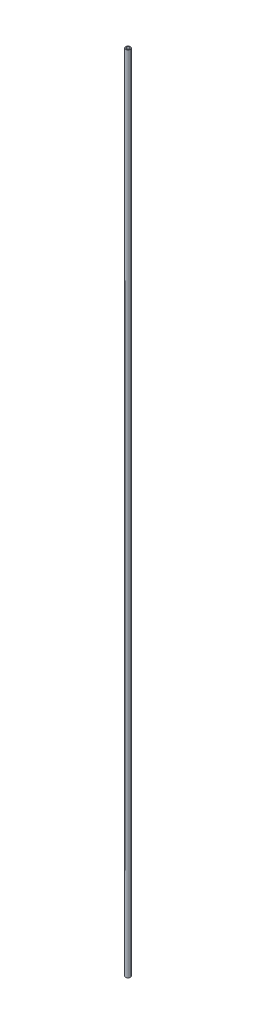
ISO-10303-21;
HEADER;
FILE_DESCRIPTION(('STEP AP214'),'2;1');
FILE_NAME('part.step','',(''),(''),'','','');
FILE_SCHEMA(('AUTOMOTIVE_DESIGN { 1 0 10303 214 1 1 1 1 }'));
ENDSEC;
DATA;
#1=APPLICATION_CONTEXT('core data for automotive mechanical design processes');
#2=APPLICATION_PROTOCOL_DEFINITION('international standard','automotive_design',2000,#1);
#3=PRODUCT_CONTEXT('',#1,'mechanical');
#4=PRODUCT('Part','Part','',(#3));
#5=PRODUCT_RELATED_PRODUCT_CATEGORY('part','',(#4));
#6=PRODUCT_DEFINITION_FORMATION('','',#4);
#7=PRODUCT_DEFINITION_CONTEXT('part definition',#1,'design');
#8=PRODUCT_DEFINITION('design','',#6,#7);
#9=PRODUCT_DEFINITION_SHAPE('','',#8);
#10=(LENGTH_UNIT() NAMED_UNIT(*) SI_UNIT(.MILLI.,.METRE.));
#11=(NAMED_UNIT(*) PLANE_ANGLE_UNIT() SI_UNIT($,.RADIAN.));
#12=(NAMED_UNIT(*) SI_UNIT($,.STERADIAN.) SOLID_ANGLE_UNIT());
#13=UNCERTAINTY_MEASURE_WITH_UNIT(LENGTH_MEASURE(1.E-05),#10,'distance_accuracy_value','');
#14=(GEOMETRIC_REPRESENTATION_CONTEXT(3) GLOBAL_UNCERTAINTY_ASSIGNED_CONTEXT((#13)) GLOBAL_UNIT_ASSIGNED_CONTEXT((#10,
#11,#12)) REPRESENTATION_CONTEXT('',''));
#15=CARTESIAN_POINT('',(0.,0.,0.));
#16=DIRECTION('',(0.,0.,1.));
#17=DIRECTION('',(1.,0.,0.));
#18=AXIS2_PLACEMENT_3D('',#15,#16,#17);
#19=CARTESIAN_POINT('',(0.,200.,0.));
#20=DIRECTION('',(0.,-1.,0.));
#21=DIRECTION('',(0.,0.,-1.));
#22=AXIS2_PLACEMENT_3D('',#19,#20,#21);
#23=CYLINDRICAL_SURFACE('',#22,0.6);
#24=CARTESIAN_POINT('',(0.,200.,0.));
#25=DIRECTION('',(0.,1.,0.));
#26=DIRECTION('',(0.,0.,1.));
#27=AXIS2_PLACEMENT_3D('',#24,#25,#26);
#28=CIRCLE('',#27,0.6);
#29=CARTESIAN_POINT('',(0.,200.,0.6));
#30=VERTEX_POINT('',#29);
#31=EDGE_CURVE('E10',#30,#30,#28,.T.);
#32=ORIENTED_EDGE('',*,*,#31,.F.);
#33=EDGE_LOOP('',(#32));
#34=FACE_BOUND('',#33,.T.);
#35=CARTESIAN_POINT('',(0.,0.,0.));
#36=DIRECTION('',(0.,1.,0.));
#37=DIRECTION('',(0.,0.,1.));
#38=AXIS2_PLACEMENT_3D('',#35,#36,#37);
#39=CIRCLE('',#38,0.6);
#40=CARTESIAN_POINT('',(0.,0.,0.6));
#41=VERTEX_POINT('',#40);
#42=EDGE_CURVE('E40',#41,#41,#39,.T.);
#43=ORIENTED_EDGE('',*,*,#42,.T.);
#44=EDGE_LOOP('',(#43));
#45=FACE_BOUND('',#44,.T.);
#46=ADVANCED_FACE('F37',(#34,#45),#23,.T.);
#47=CARTESIAN_POINT('',(0.,200.,0.));
#48=DIRECTION('',(0.,1.,0.));
#49=DIRECTION('',(0.,0.,1.));
#50=AXIS2_PLACEMENT_3D('',#47,#48,#49);
#51=PLANE('',#50);
#52=CARTESIAN_POINT('',(0.,200.,0.));
#53=DIRECTION('',(0.,-1.,0.));
#54=DIRECTION('',(0.,0.,-1.));
#55=AXIS2_PLACEMENT_3D('',#52,#53,#54);
#56=CIRCLE('',#55,0.4);
#57=CARTESIAN_POINT('',(0.,200.,-0.4));
#58=VERTEX_POINT('',#57);
#59=EDGE_CURVE('E49',#58,#58,#56,.T.);
#60=ORIENTED_EDGE('',*,*,#59,.T.);
#61=EDGE_LOOP('',(#60));
#62=FACE_BOUND('',#61,.T.);
#63=ORIENTED_EDGE('',*,*,#31,.T.);
#64=EDGE_LOOP('',(#63));
#65=FACE_BOUND('',#64,.T.);
#66=ADVANCED_FACE('F59',(#62,#65),#51,.T.);
#67=CARTESIAN_POINT('',(0.,0.,0.));
#68=DIRECTION('',(0.,1.,0.));
#69=DIRECTION('',(0.,0.,1.));
#70=AXIS2_PLACEMENT_3D('',#67,#68,#69);
#71=PLANE('',#70);
#72=CARTESIAN_POINT('',(0.,0.,0.));
#73=DIRECTION('',(0.,-1.,0.));
#74=DIRECTION('',(0.,0.,-1.));
#75=AXIS2_PLACEMENT_3D('',#72,#73,#74);
#76=CIRCLE('',#75,0.4);
#77=CARTESIAN_POINT('',(0.,0.,-0.4));
#78=VERTEX_POINT('',#77);
#79=EDGE_CURVE('E51',#78,#78,#76,.T.);
#80=ORIENTED_EDGE('',*,*,#79,.F.);
#81=EDGE_LOOP('',(#80));
#82=FACE_BOUND('',#81,.T.);
#83=ORIENTED_EDGE('',*,*,#42,.F.);
#84=EDGE_LOOP('',(#83));
#85=FACE_BOUND('',#84,.T.);
#86=ADVANCED_FACE('F64',(#82,#85),#71,.F.);
#87=CARTESIAN_POINT('',(0.,200.,0.));
#88=DIRECTION('',(0.,-1.,0.));
#89=DIRECTION('',(0.,0.,-1.));
#90=AXIS2_PLACEMENT_3D('',#87,#88,#89);
#91=CYLINDRICAL_SURFACE('',#90,0.4);
#92=ORIENTED_EDGE('',*,*,#59,.F.);
#93=EDGE_LOOP('',(#92));
#94=FACE_BOUND('',#93,.T.);
#95=ORIENTED_EDGE('',*,*,#79,.T.);
#96=EDGE_LOOP('',(#95));
#97=FACE_BOUND('',#96,.T.);
#98=ADVANCED_FACE('F61',(#94,#97),#91,.F.);
#99=CLOSED_SHELL('',(#46,#66,#86,#98));
#100=MANIFOLD_SOLID_BREP('B2',#99);
#101=ADVANCED_BREP_SHAPE_REPRESENTATION('',(#18,#100),#14);
#102=SHAPE_DEFINITION_REPRESENTATION(#9,#101);
ENDSEC;
END-ISO-10303-21;
